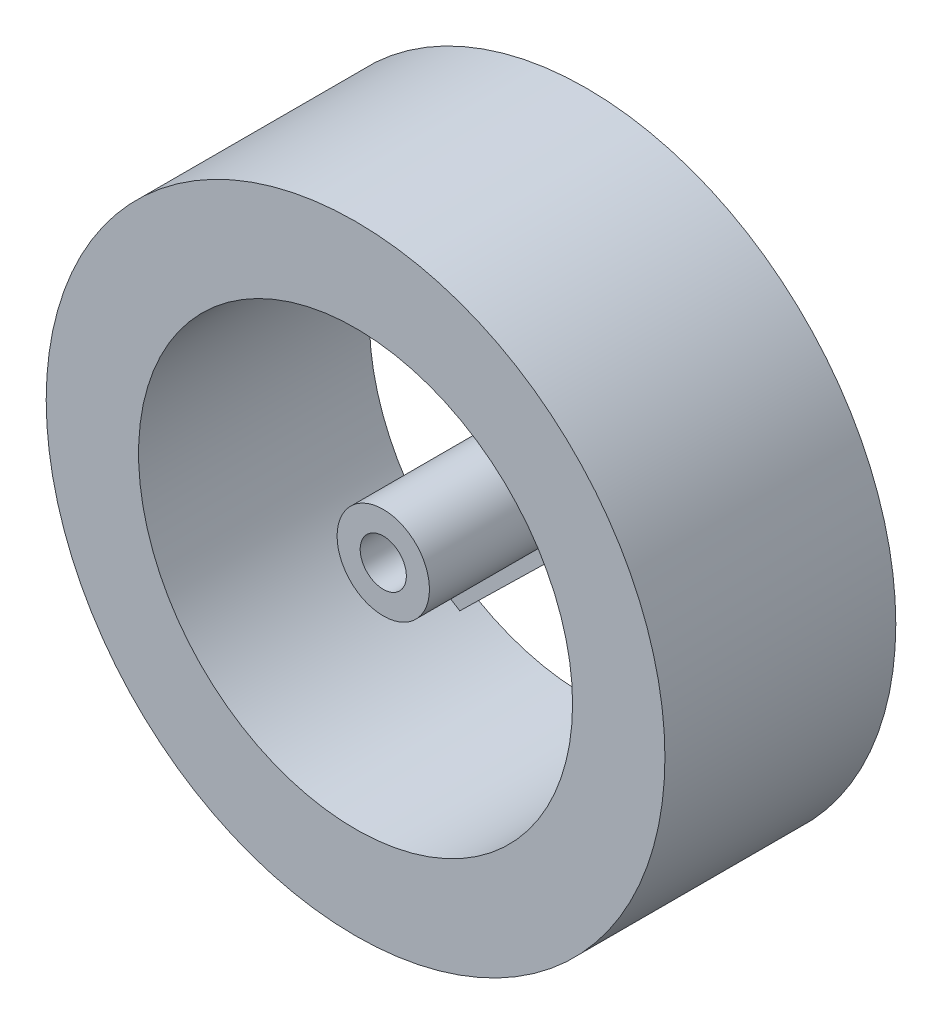
ISO-10303-21;
HEADER;
FILE_DESCRIPTION(('STEP AP214'),'2;1');
FILE_NAME('part.step','',(''),(''),'','','');
FILE_SCHEMA(('AUTOMOTIVE_DESIGN { 1 0 10303 214 1 1 1 1 }'));
ENDSEC;
DATA;
#1=APPLICATION_CONTEXT('core data for automotive mechanical design processes');
#2=APPLICATION_PROTOCOL_DEFINITION('international standard','automotive_design',2000,#1);
#3=PRODUCT_CONTEXT('',#1,'mechanical');
#4=PRODUCT('Part','Part','',(#3));
#5=PRODUCT_RELATED_PRODUCT_CATEGORY('part','',(#4));
#6=PRODUCT_DEFINITION_FORMATION('','',#4);
#7=PRODUCT_DEFINITION_CONTEXT('part definition',#1,'design');
#8=PRODUCT_DEFINITION('design','',#6,#7);
#9=PRODUCT_DEFINITION_SHAPE('','',#8);
#10=(LENGTH_UNIT() NAMED_UNIT(*) SI_UNIT(.MILLI.,.METRE.));
#11=(NAMED_UNIT(*) PLANE_ANGLE_UNIT() SI_UNIT($,.RADIAN.));
#12=(NAMED_UNIT(*) SI_UNIT($,.STERADIAN.) SOLID_ANGLE_UNIT());
#13=UNCERTAINTY_MEASURE_WITH_UNIT(LENGTH_MEASURE(1.E-05),#10,'distance_accuracy_value','');
#14=(GEOMETRIC_REPRESENTATION_CONTEXT(3) GLOBAL_UNCERTAINTY_ASSIGNED_CONTEXT((#13)) GLOBAL_UNIT_ASSIGNED_CONTEXT((#10,
#11,#12)) REPRESENTATION_CONTEXT('',''));
#15=CARTESIAN_POINT('',(0.,0.,0.));
#16=DIRECTION('',(0.,0.,1.));
#17=DIRECTION('',(1.,0.,0.));
#18=AXIS2_PLACEMENT_3D('',#15,#16,#17);
#19=CARTESIAN_POINT('',(0.,0.,25.));
#20=DIRECTION('',(0.,0.,-1.));
#21=DIRECTION('',(-1.,0.,0.));
#22=AXIS2_PLACEMENT_3D('',#19,#20,#21);
#23=CYLINDRICAL_SURFACE('',#22,23.5);
#24=CARTESIAN_POINT('',(0.,0.,25.));
#25=DIRECTION('',(0.,0.,1.));
#26=DIRECTION('',(1.,0.,0.));
#27=AXIS2_PLACEMENT_3D('',#24,#25,#26);
#28=CIRCLE('',#27,23.5);
#29=CARTESIAN_POINT('',(23.5,0.,25.));
#30=VERTEX_POINT('',#29);
#31=EDGE_CURVE('E316',#30,#30,#28,.T.);
#32=ORIENTED_EDGE('',*,*,#31,.T.);
#33=EDGE_LOOP('',(#32));
#34=FACE_BOUND('',#33,.T.);
#35=CARTESIAN_POINT('',(0.,0.,2.));
#36=DIRECTION('',(0.,0.,-1.));
#37=DIRECTION('',(-1.,0.,0.));
#38=AXIS2_PLACEMENT_3D('',#35,#36,#37);
#39=CIRCLE('',#38,23.5);
#40=CARTESIAN_POINT('',(-21.4504554995812,9.598331045577,2.));
#41=VERTEX_POINT('',#40);
#42=CARTESIAN_POINT('',(-22.9955404714559,4.84304846410122,2.));
#43=VERTEX_POINT('',#42);
#44=EDGE_CURVE('E237',#41,#43,#39,.F.);
#45=ORIENTED_EDGE('',*,*,#44,.F.);
#46=DIRECTION('',(0.,0.,-1.));
#47=VECTOR('',#46,1.);
#48=CARTESIAN_POINT('',(-21.4504554995812,9.598331045577,2.));
#49=LINE('',#48,#47);
#50=CARTESIAN_POINT('',(-21.4504554995812,9.598331045577,0.));
#51=VERTEX_POINT('',#50);
#52=EDGE_CURVE('E281',#41,#51,#49,.T.);
#53=ORIENTED_EDGE('',*,*,#52,.T.);
#54=CARTESIAN_POINT('',(0.,0.,0.));
#55=DIRECTION('',(0.,0.,1.));
#56=DIRECTION('',(1.,0.,0.));
#57=AXIS2_PLACEMENT_3D('',#54,#55,#56);
#58=CIRCLE('',#57,23.5);
#59=CARTESIAN_POINT('',(-2.5,23.3666428910959,0.));
#60=VERTEX_POINT('',#59);
#61=EDGE_CURVE('E339',#60,#51,#58,.T.);
#62=ORIENTED_EDGE('',*,*,#61,.F.);
#63=DIRECTION('',(0.,0.,-1.));
#64=VECTOR('',#63,1.);
#65=CARTESIAN_POINT('',(-2.5,23.3666428910959,2.));
#66=LINE('',#65,#64);
#67=CARTESIAN_POINT('',(-2.5,23.3666428910959,2.));
#68=VERTEX_POINT('',#67);
#69=EDGE_CURVE('E274',#68,#60,#66,.T.);
#70=ORIENTED_EDGE('',*,*,#69,.F.);
#71=CARTESIAN_POINT('',(0.,0.,2.));
#72=DIRECTION('',(0.,0.,-1.));
#73=DIRECTION('',(-1.,0.,0.));
#74=AXIS2_PLACEMENT_3D('',#71,#72,#73);
#75=CIRCLE('',#74,23.5);
#76=CARTESIAN_POINT('',(2.5,23.3666428910959,2.));
#77=VERTEX_POINT('',#76);
#78=EDGE_CURVE('E188',#77,#68,#75,.F.);
#79=ORIENTED_EDGE('',*,*,#78,.F.);
#80=DIRECTION('',(0.,0.,-1.));
#81=VECTOR('',#80,1.);
#82=CARTESIAN_POINT('',(2.5,23.3666428910959,2.));
#83=LINE('',#82,#81);
#84=CARTESIAN_POINT('',(2.5,23.3666428910959,0.));
#85=VERTEX_POINT('',#84);
#86=EDGE_CURVE('E194',#77,#85,#83,.T.);
#87=ORIENTED_EDGE('',*,*,#86,.T.);
#88=CARTESIAN_POINT('',(21.4504554995811,9.5983310455773,0.));
#89=VERTEX_POINT('',#88);
#90=EDGE_CURVE('E320',#89,#85,#58,.T.);
#91=ORIENTED_EDGE('',*,*,#90,.F.);
#92=DIRECTION('',(0.,0.,-1.));
#93=VECTOR('',#92,1.);
#94=CARTESIAN_POINT('',(21.4504554995811,9.5983310455773,2.));
#95=LINE('',#94,#93);
#96=CARTESIAN_POINT('',(21.4504554995811,9.5983310455773,2.));
#97=VERTEX_POINT('',#96);
#98=EDGE_CURVE('E312',#97,#89,#95,.T.);
#99=ORIENTED_EDGE('',*,*,#98,.F.);
#100=CARTESIAN_POINT('',(0.,0.,2.));
#101=DIRECTION('',(0.,0.,-1.));
#102=DIRECTION('',(-1.,0.,0.));
#103=AXIS2_PLACEMENT_3D('',#100,#101,#102);
#104=CIRCLE('',#103,23.5);
#105=CARTESIAN_POINT('',(22.9955404714558,4.84304846410155,2.));
#106=VERTEX_POINT('',#105);
#107=EDGE_CURVE('E206',#106,#97,#104,.F.);
#108=ORIENTED_EDGE('',*,*,#107,.F.);
#109=DIRECTION('',(0.,0.,-1.));
#110=VECTOR('',#109,1.);
#111=CARTESIAN_POINT('',(22.9955404714558,4.84304846410155,2.));
#112=LINE('',#111,#110);
#113=CARTESIAN_POINT('',(22.9955404714558,4.84304846410155,0.));
#114=VERTEX_POINT('',#113);
#115=EDGE_CURVE('E309',#106,#114,#112,.T.);
#116=ORIENTED_EDGE('',*,*,#115,.T.);
#117=CARTESIAN_POINT('',(15.7571105729084,-17.4345480696558,0.));
#118=VERTEX_POINT('',#117);
#119=EDGE_CURVE('E273',#118,#114,#58,.T.);
#120=ORIENTED_EDGE('',*,*,#119,.F.);
#121=DIRECTION('',(0.,0.,-1.));
#122=VECTOR('',#121,1.);
#123=CARTESIAN_POINT('',(15.7571105729084,-17.4345480696558,2.));
#124=LINE('',#123,#122);
#125=CARTESIAN_POINT('',(15.7571105729084,-17.4345480696558,2.));
#126=VERTEX_POINT('',#125);
#127=EDGE_CURVE('E303',#126,#118,#124,.T.);
#128=ORIENTED_EDGE('',*,*,#127,.F.);
#129=CARTESIAN_POINT('',(0.,0.,2.));
#130=DIRECTION('',(0.,0.,-1.));
#131=DIRECTION('',(-1.,0.,0.));
#132=AXIS2_PLACEMENT_3D('',#129,#130,#131);
#133=CIRCLE('',#132,23.5);
#134=CARTESIAN_POINT('',(11.7120256010337,-20.3734743311182,2.));
#135=VERTEX_POINT('',#134);
#136=EDGE_CURVE('E219',#135,#126,#133,.F.);
#137=ORIENTED_EDGE('',*,*,#136,.F.);
#138=DIRECTION('',(0.,0.,-1.));
#139=VECTOR('',#138,1.);
#140=CARTESIAN_POINT('',(11.7120256010337,-20.3734743311182,2.));
#141=LINE('',#140,#139);
#142=CARTESIAN_POINT('',(11.7120256010337,-20.3734743311182,0.));
#143=VERTEX_POINT('',#142);
#144=EDGE_CURVE('E300',#135,#143,#141,.T.);
#145=ORIENTED_EDGE('',*,*,#144,.T.);
#146=CARTESIAN_POINT('',(-11.7120256010334,-20.3734743311183,0.));
#147=VERTEX_POINT('',#146);
#148=EDGE_CURVE('E322',#147,#143,#58,.T.);
#149=ORIENTED_EDGE('',*,*,#148,.F.);
#150=DIRECTION('',(0.,0.,-1.));
#151=VECTOR('',#150,1.);
#152=CARTESIAN_POINT('',(-11.7120256010334,-20.3734743311183,2.));
#153=LINE('',#152,#151);
#154=CARTESIAN_POINT('',(-11.7120256010334,-20.3734743311183,2.));
#155=VERTEX_POINT('',#154);
#156=EDGE_CURVE('E294',#155,#147,#153,.T.);
#157=ORIENTED_EDGE('',*,*,#156,.F.);
#158=CARTESIAN_POINT('',(0.,0.,2.));
#159=DIRECTION('',(0.,0.,-1.));
#160=DIRECTION('',(-1.,0.,0.));
#161=AXIS2_PLACEMENT_3D('',#158,#159,#160);
#162=CIRCLE('',#161,23.5);
#163=CARTESIAN_POINT('',(-15.7571105729082,-17.434548069656,2.));
#164=VERTEX_POINT('',#163);
#165=EDGE_CURVE('E228',#164,#155,#162,.F.);
#166=ORIENTED_EDGE('',*,*,#165,.F.);
#167=DIRECTION('',(0.,0.,-1.));
#168=VECTOR('',#167,1.);
#169=CARTESIAN_POINT('',(-15.7571105729082,-17.434548069656,2.));
#170=LINE('',#169,#168);
#171=CARTESIAN_POINT('',(-15.7571105729082,-17.434548069656,0.));
#172=VERTEX_POINT('',#171);
#173=EDGE_CURVE('E291',#164,#172,#170,.T.);
#174=ORIENTED_EDGE('',*,*,#173,.T.);
#175=CARTESIAN_POINT('',(-22.9955404714559,4.84304846410122,0.));
#176=VERTEX_POINT('',#175);
#177=EDGE_CURVE('E337',#176,#172,#58,.T.);
#178=ORIENTED_EDGE('',*,*,#177,.F.);
#179=DIRECTION('',(0.,0.,-1.));
#180=VECTOR('',#179,1.);
#181=CARTESIAN_POINT('',(-22.9955404714559,4.84304846410122,2.));
#182=LINE('',#181,#180);
#183=EDGE_CURVE('E284',#43,#176,#182,.T.);
#184=ORIENTED_EDGE('',*,*,#183,.F.);
#185=EDGE_LOOP('',(#45,#53,#62,#70,#79,#87,#91,#99,#108,#116,#120,#128,#137,#145,#149,#157,#166,
#174,#178,#184));
#186=FACE_BOUND('',#185,.T.);
#187=ADVANCED_FACE('F37',(#34,#186),#23,.F.);
#188=CARTESIAN_POINT('',(0.,0.,25.));
#189=DIRECTION('',(0.,0.,1.));
#190=DIRECTION('',(1.,0.,0.));
#191=AXIS2_PLACEMENT_3D('',#188,#189,#190);
#192=PLANE('',#191);
#193=CARTESIAN_POINT('',(0.,0.,25.));
#194=DIRECTION('',(0.,0.,1.));
#195=DIRECTION('',(1.,0.,0.));
#196=AXIS2_PLACEMENT_3D('',#193,#194,#195);
#197=CIRCLE('',#196,33.5);
#198=CARTESIAN_POINT('',(33.5,0.,25.));
#199=VERTEX_POINT('',#198);
#200=EDGE_CURVE('E45',#199,#199,#197,.T.);
#201=ORIENTED_EDGE('',*,*,#200,.T.);
#202=EDGE_LOOP('',(#201));
#203=FACE_BOUND('',#202,.T.);
#204=ORIENTED_EDGE('',*,*,#31,.F.);
#205=EDGE_LOOP('',(#204));
#206=FACE_BOUND('',#205,.T.);
#207=ADVANCED_FACE('F330',(#203,#206),#192,.T.);
#208=CARTESIAN_POINT('',(0.,0.,0.));
#209=DIRECTION('',(0.,0.,1.));
#210=DIRECTION('',(1.,0.,0.));
#211=AXIS2_PLACEMENT_3D('',#208,#209,#210);
#212=PLANE('',#211);
#213=DIRECTION('',(-0.885817411892807,0.464033956502678,0.));
#214=VECTOR('',#213,1.);
#215=CARTESIAN_POINT('',(-2.96084057115355,-5.65209527236682,0.));
#216=LINE('',#215,#214);
#217=CARTESIAN_POINT('',(-9.78147600733805,-2.07911690817762,0.));
#218=VERTEX_POINT('',#217);
#219=EDGE_CURVE('E267',#218,#176,#216,.T.);
#220=ORIENTED_EDGE('',*,*,#219,.T.);
#221=ORIENTED_EDGE('',*,*,#177,.T.);
#222=DIRECTION('',(-0.443889023939305,-0.896081767712194,0.));
#223=VECTOR('',#222,1.);
#224=CARTESIAN_POINT('',(-5.71758858534729,2.83230270705772,0.));
#225=LINE('',#224,#223);
#226=CARTESIAN_POINT('',(-9.13545457642599,-4.06736643075806,0.));
#227=VERTEX_POINT('',#226);
#228=EDGE_CURVE('E264',#227,#172,#225,.T.);
#229=ORIENTED_EDGE('',*,*,#228,.F.);
#230=CARTESIAN_POINT('',(0.,0.,0.));
#231=DIRECTION('',(0.,0.,-1.));
#232=DIRECTION('',(-1.,0.,0.));
#233=AXIS2_PLACEMENT_3D('',#230,#231,#232);
#234=CIRCLE('',#233,10.);
#235=EDGE_CURVE('E266',#227,#218,#234,.T.);
#236=ORIENTED_EDGE('',*,*,#235,.T.);
#237=EDGE_LOOP('',(#220,#221,#229,#236));
#238=FACE_BOUND('',#237,.T.);
#239=DIRECTION('',(0.167589883925987,0.985856800354734,0.));
#240=VECTOR('',#239,1.);
#241=CARTESIAN_POINT('',(-6.29041209362676,1.06933322591902,0.));
#242=LINE('',#241,#240);
#243=CARTESIAN_POINT('',(-5.,8.66025403784439,0.));
#244=VERTEX_POINT('',#243);
#245=EDGE_CURVE('E197',#244,#60,#242,.T.);
#246=ORIENTED_EDGE('',*,*,#245,.T.);
#247=ORIENTED_EDGE('',*,*,#61,.T.);
#248=DIRECTION('',(-0.989393656329716,0.145259054156762,0.));
#249=VECTOR('',#248,1.);
#250=CARTESIAN_POINT('',(0.926847905951142,6.31297955128433,0.));
#251=LINE('',#250,#249);
#252=CARTESIAN_POINT('',(-6.69130606358861,7.43144825477392,0.));
#253=VERTEX_POINT('',#252);
#254=EDGE_CURVE('E269',#253,#51,#251,.T.);
#255=ORIENTED_EDGE('',*,*,#254,.F.);
#256=EDGE_CURVE('E254',#253,#244,#234,.T.);
#257=ORIENTED_EDGE('',*,*,#256,.T.);
#258=EDGE_LOOP('',(#246,#247,#255,#257));
#259=FACE_BOUND('',#258,.T.);
#260=DIRECTION('',(0.989393656329713,0.145259054156776,0.));
#261=VECTOR('',#260,1.);
#262=CARTESIAN_POINT('',(-0.926847905951231,6.31297955128432,0.));
#263=LINE('',#262,#261);
#264=CARTESIAN_POINT('',(6.6913060635885,7.43144825477402,0.));
#265=VERTEX_POINT('',#264);
#266=EDGE_CURVE('E253',#265,#89,#263,.T.);
#267=ORIENTED_EDGE('',*,*,#266,.T.);
#268=ORIENTED_EDGE('',*,*,#90,.T.);
#269=DIRECTION('',(-0.167589883925987,0.985856800354734,0.));
#270=VECTOR('',#269,1.);
#271=CARTESIAN_POINT('',(6.29041209362676,1.06933322591902,0.));
#272=LINE('',#271,#270);
#273=CARTESIAN_POINT('',(5.,8.66025403784439,0.));
#274=VERTEX_POINT('',#273);
#275=EDGE_CURVE('E249',#274,#85,#272,.T.);
#276=ORIENTED_EDGE('',*,*,#275,.F.);
#277=EDGE_CURVE('E184',#274,#265,#234,.T.);
#278=ORIENTED_EDGE('',*,*,#277,.T.);
#279=EDGE_LOOP('',(#267,#268,#276,#278));
#280=FACE_BOUND('',#279,.T.);
#281=DIRECTION('',(0.443889023939318,-0.896081767712188,0.));
#282=VECTOR('',#281,1.);
#283=CARTESIAN_POINT('',(5.71758858534725,2.83230270705781,0.));
#284=LINE('',#283,#282);
#285=CARTESIAN_POINT('',(9.13545457642605,-4.06736643075792,0.));
#286=VERTEX_POINT('',#285);
#287=EDGE_CURVE('E52',#286,#118,#284,.T.);
#288=ORIENTED_EDGE('',*,*,#287,.T.);
#289=ORIENTED_EDGE('',*,*,#119,.T.);
#290=DIRECTION('',(0.8858174118928,0.46403395650269,0.));
#291=VECTOR('',#290,1.);
#292=CARTESIAN_POINT('',(2.96084057115362,-5.65209527236677,0.));
#293=LINE('',#292,#291);
#294=CARTESIAN_POINT('',(9.78147600733808,-2.07911690817748,0.));
#295=VERTEX_POINT('',#294);
#296=EDGE_CURVE('E257',#295,#114,#293,.T.);
#297=ORIENTED_EDGE('',*,*,#296,.F.);
#298=EDGE_CURVE('E255',#295,#286,#234,.T.);
#299=ORIENTED_EDGE('',*,*,#298,.T.);
#300=EDGE_LOOP('',(#288,#289,#297,#299));
#301=FACE_BOUND('',#300,.T.);
#302=CARTESIAN_POINT('',(0.,0.,0.));
#303=DIRECTION('',(0.,0.,1.));
#304=DIRECTION('',(1.,0.,0.));
#305=AXIS2_PLACEMENT_3D('',#302,#303,#304);
#306=CIRCLE('',#305,33.5);
#307=CARTESIAN_POINT('',(33.5,0.,0.));
#308=VERTEX_POINT('',#307);
#309=EDGE_CURVE('E319',#308,#308,#306,.T.);
#310=ORIENTED_EDGE('',*,*,#309,.F.);
#311=EDGE_LOOP('',(#310));
#312=FACE_BOUND('',#311,.T.);
#313=ORIENTED_EDGE('',*,*,#148,.T.);
#314=DIRECTION('',(0.715055152302212,-0.699068043301981,0.));
#315=VECTOR('',#314,1.);
#316=CARTESIAN_POINT('',(-4.46051198538416,-4.56252021189434,0.));
#317=LINE('',#316,#315);
#318=CARTESIAN_POINT('',(1.04528463267663,-9.94521895368272,0.));
#319=VERTEX_POINT('',#318);
#320=EDGE_CURVE('E260',#319,#143,#317,.T.);
#321=ORIENTED_EDGE('',*,*,#320,.F.);
#322=CARTESIAN_POINT('',(-1.04528463267648,-9.94521895368274,0.));
#323=VERTEX_POINT('',#322);
#324=EDGE_CURVE('E262',#319,#323,#234,.T.);
#325=ORIENTED_EDGE('',*,*,#324,.T.);
#326=DIRECTION('',(-0.715055152302202,-0.699068043301991,0.));
#327=VECTOR('',#326,1.);
#328=CARTESIAN_POINT('',(4.46051198538423,-4.56252021189428,0.));
#329=LINE('',#328,#327);
#330=EDGE_CURVE('E60',#323,#147,#329,.T.);
#331=ORIENTED_EDGE('',*,*,#330,.T.);
#332=EDGE_LOOP('',(#313,#321,#325,#331));
#333=FACE_BOUND('',#332,.T.);
#334=ADVANCED_FACE('F328',(#238,#259,#280,#301,#312,#333),#212,.F.);
#335=CARTESIAN_POINT('',(0.,0.,25.));
#336=DIRECTION('',(0.,0.,-1.));
#337=DIRECTION('',(-1.,0.,0.));
#338=AXIS2_PLACEMENT_3D('',#335,#336,#337);
#339=CYLINDRICAL_SURFACE('',#338,33.5);
#340=ORIENTED_EDGE('',*,*,#200,.F.);
#341=EDGE_LOOP('',(#340));
#342=FACE_BOUND('',#341,.T.);
#343=ORIENTED_EDGE('',*,*,#309,.T.);
#344=EDGE_LOOP('',(#343));
#345=FACE_BOUND('',#344,.T.);
#346=ADVANCED_FACE('F39',(#342,#345),#339,.T.);
#347=CARTESIAN_POINT('',(6.29041209362676,1.06933322591902,2.));
#348=DIRECTION('',(-0.985856800354734,-0.167589883925987,0.));
#349=DIRECTION('',(0.167589883925987,-0.985856800354734,0.));
#350=AXIS2_PLACEMENT_3D('',#347,#348,#349);
#351=PLANE('',#350);
#352=ORIENTED_EDGE('',*,*,#275,.T.);
#353=ORIENTED_EDGE('',*,*,#86,.F.);
#354=DIRECTION('',(-0.167589883925987,0.985856800354734,0.));
#355=VECTOR('',#354,1.);
#356=CARTESIAN_POINT('',(6.29041209362676,1.06933322591902,2.));
#357=LINE('',#356,#355);
#358=CARTESIAN_POINT('',(5.,8.66025403784439,2.));
#359=VERTEX_POINT('',#358);
#360=EDGE_CURVE('E191',#359,#77,#357,.T.);
#361=ORIENTED_EDGE('',*,*,#360,.F.);
#362=DIRECTION('',(0.,0.,-1.));
#363=VECTOR('',#362,1.);
#364=CARTESIAN_POINT('',(5.,8.66025403784439,2.));
#365=LINE('',#364,#363);
#366=EDGE_CURVE('E178',#359,#274,#365,.T.);
#367=ORIENTED_EDGE('',*,*,#366,.T.);
#368=EDGE_LOOP('',(#352,#353,#361,#367));
#369=FACE_BOUND('',#368,.T.);
#370=ADVANCED_FACE('F192',(#369),#351,.F.);
#371=CARTESIAN_POINT('',(-6.29041209362676,1.06933322591902,2.));
#372=DIRECTION('',(-0.985856800354734,0.167589883925987,0.));
#373=DIRECTION('',(-0.167589883925987,-0.985856800354734,0.));
#374=AXIS2_PLACEMENT_3D('',#371,#372,#373);
#375=PLANE('',#374);
#376=ORIENTED_EDGE('',*,*,#245,.F.);
#377=DIRECTION('',(0.,0.,-1.));
#378=VECTOR('',#377,1.);
#379=CARTESIAN_POINT('',(-5.,8.66025403784439,2.));
#380=LINE('',#379,#378);
#381=CARTESIAN_POINT('',(-5.,8.66025403784439,2.));
#382=VERTEX_POINT('',#381);
#383=EDGE_CURVE('E277',#382,#244,#380,.T.);
#384=ORIENTED_EDGE('',*,*,#383,.F.);
#385=DIRECTION('',(0.167589883925987,0.985856800354734,0.));
#386=VECTOR('',#385,1.);
#387=CARTESIAN_POINT('',(-6.29041209362676,1.06933322591902,2.));
#388=LINE('',#387,#386);
#389=EDGE_CURVE('E209',#382,#68,#388,.T.);
#390=ORIENTED_EDGE('',*,*,#389,.T.);
#391=ORIENTED_EDGE('',*,*,#69,.T.);
#392=EDGE_LOOP('',(#376,#384,#390,#391));
#393=FACE_BOUND('',#392,.T.);
#394=ADVANCED_FACE('F358',(#393),#375,.T.);
#395=CARTESIAN_POINT('',(0.,0.,2.));
#396=DIRECTION('',(0.,0.,-1.));
#397=DIRECTION('',(-1.,0.,0.));
#398=AXIS2_PLACEMENT_3D('',#395,#396,#397);
#399=CYLINDRICAL_SURFACE('',#398,10.);
#400=ORIENTED_EDGE('',*,*,#256,.F.);
#401=DIRECTION('',(0.,0.,-1.));
#402=VECTOR('',#401,1.);
#403=CARTESIAN_POINT('',(-6.69130606358861,7.43144825477392,2.));
#404=LINE('',#403,#402);
#405=CARTESIAN_POINT('',(-6.69130606358861,7.43144825477392,2.));
#406=VERTEX_POINT('',#405);
#407=EDGE_CURVE('E279',#406,#253,#404,.T.);
#408=ORIENTED_EDGE('',*,*,#407,.F.);
#409=CARTESIAN_POINT('',(0.,0.,2.));
#410=DIRECTION('',(0.,0.,-1.));
#411=DIRECTION('',(-1.,0.,0.));
#412=AXIS2_PLACEMENT_3D('',#409,#410,#411);
#413=CIRCLE('',#412,10.);
#414=EDGE_CURVE('E204',#406,#382,#413,.T.);
#415=ORIENTED_EDGE('',*,*,#414,.T.);
#416=ORIENTED_EDGE('',*,*,#383,.T.);
#417=EDGE_LOOP('',(#400,#408,#415,#416));
#418=FACE_BOUND('',#417,.T.);
#419=ADVANCED_FACE('F362',(#418),#399,.T.);
#420=CARTESIAN_POINT('',(0.926847905951142,6.31297955128433,2.));
#421=DIRECTION('',(-0.145259054156762,-0.989393656329716,0.));
#422=DIRECTION('',(0.989393656329715,-0.145259054156762,0.));
#423=AXIS2_PLACEMENT_3D('',#420,#421,#422);
#424=PLANE('',#423);
#425=ORIENTED_EDGE('',*,*,#254,.T.);
#426=ORIENTED_EDGE('',*,*,#52,.F.);
#427=DIRECTION('',(-0.989393656329716,0.145259054156762,0.));
#428=VECTOR('',#427,1.);
#429=CARTESIAN_POINT('',(0.926847905951142,6.31297955128433,2.));
#430=LINE('',#429,#428);
#431=EDGE_CURVE('E210',#406,#41,#430,.T.);
#432=ORIENTED_EDGE('',*,*,#431,.F.);
#433=ORIENTED_EDGE('',*,*,#407,.T.);
#434=EDGE_LOOP('',(#425,#426,#432,#433));
#435=FACE_BOUND('',#434,.T.);
#436=ADVANCED_FACE('F367',(#435),#424,.F.);
#437=CARTESIAN_POINT('',(-2.96084057115355,-5.65209527236682,2.));
#438=DIRECTION('',(-0.464033956502678,-0.885817411892807,0.));
#439=DIRECTION('',(0.885817411892807,-0.464033956502678,0.));
#440=AXIS2_PLACEMENT_3D('',#437,#438,#439);
#441=PLANE('',#440);
#442=ORIENTED_EDGE('',*,*,#219,.F.);
#443=DIRECTION('',(0.,0.,-1.));
#444=VECTOR('',#443,1.);
#445=CARTESIAN_POINT('',(-9.78147600733805,-2.07911690817762,2.));
#446=LINE('',#445,#444);
#447=CARTESIAN_POINT('',(-9.78147600733805,-2.07911690817762,2.));
#448=VERTEX_POINT('',#447);
#449=EDGE_CURVE('E287',#448,#218,#446,.T.);
#450=ORIENTED_EDGE('',*,*,#449,.F.);
#451=DIRECTION('',(-0.885817411892807,0.464033956502678,0.));
#452=VECTOR('',#451,1.);
#453=CARTESIAN_POINT('',(-2.96084057115355,-5.65209527236682,2.));
#454=LINE('',#453,#452);
#455=EDGE_CURVE('E232',#448,#43,#454,.T.);
#456=ORIENTED_EDGE('',*,*,#455,.T.);
#457=ORIENTED_EDGE('',*,*,#183,.T.);
#458=EDGE_LOOP('',(#442,#450,#456,#457));
#459=FACE_BOUND('',#458,.T.);
#460=ADVANCED_FACE('F371',(#459),#441,.T.);
#461=ORIENTED_EDGE('',*,*,#235,.F.);
#462=DIRECTION('',(0.,0.,-1.));
#463=VECTOR('',#462,1.);
#464=CARTESIAN_POINT('',(-9.13545457642599,-4.06736643075806,2.));
#465=LINE('',#464,#463);
#466=CARTESIAN_POINT('',(-9.13545457642599,-4.06736643075806,2.));
#467=VERTEX_POINT('',#466);
#468=EDGE_CURVE('E289',#467,#227,#465,.T.);
#469=ORIENTED_EDGE('',*,*,#468,.F.);
#470=EDGE_CURVE('E211',#467,#448,#413,.T.);
#471=ORIENTED_EDGE('',*,*,#470,.T.);
#472=ORIENTED_EDGE('',*,*,#449,.T.);
#473=EDGE_LOOP('',(#461,#469,#471,#472));
#474=FACE_BOUND('',#473,.T.);
#475=ADVANCED_FACE('F374',(#474),#399,.T.);
#476=CARTESIAN_POINT('',(-5.71758858534729,2.83230270705772,2.));
#477=DIRECTION('',(0.896081767712195,-0.443889023939305,0.));
#478=DIRECTION('',(0.443889023939305,0.896081767712195,0.));
#479=AXIS2_PLACEMENT_3D('',#476,#477,#478);
#480=PLANE('',#479);
#481=ORIENTED_EDGE('',*,*,#228,.T.);
#482=ORIENTED_EDGE('',*,*,#173,.F.);
#483=DIRECTION('',(-0.443889023939305,-0.896081767712194,0.));
#484=VECTOR('',#483,1.);
#485=CARTESIAN_POINT('',(-5.71758858534729,2.83230270705772,2.));
#486=LINE('',#485,#484);
#487=EDGE_CURVE('E233',#467,#164,#486,.T.);
#488=ORIENTED_EDGE('',*,*,#487,.F.);
#489=ORIENTED_EDGE('',*,*,#468,.T.);
#490=EDGE_LOOP('',(#481,#482,#488,#489));
#491=FACE_BOUND('',#490,.T.);
#492=ADVANCED_FACE('F499',(#491),#480,.F.);
#493=CARTESIAN_POINT('',(4.46051198538423,-4.56252021189428,2.));
#494=DIRECTION('',(0.699068043301991,-0.715055152302202,0.));
#495=DIRECTION('',(0.715055152302202,0.699068043301991,0.));
#496=AXIS2_PLACEMENT_3D('',#493,#494,#495);
#497=PLANE('',#496);
#498=ORIENTED_EDGE('',*,*,#330,.F.);
#499=DIRECTION('',(0.,0.,-1.));
#500=VECTOR('',#499,1.);
#501=CARTESIAN_POINT('',(-1.04528463267648,-9.94521895368274,2.));
#502=LINE('',#501,#500);
#503=CARTESIAN_POINT('',(-1.04528463267648,-9.94521895368274,2.));
#504=VERTEX_POINT('',#503);
#505=EDGE_CURVE('E296',#504,#323,#502,.T.);
#506=ORIENTED_EDGE('',*,*,#505,.F.);
#507=DIRECTION('',(-0.715055152302202,-0.699068043301991,0.));
#508=VECTOR('',#507,1.);
#509=CARTESIAN_POINT('',(4.46051198538423,-4.56252021189428,2.));
#510=LINE('',#509,#508);
#511=EDGE_CURVE('E223',#504,#155,#510,.T.);
#512=ORIENTED_EDGE('',*,*,#511,.T.);
#513=ORIENTED_EDGE('',*,*,#156,.T.);
#514=EDGE_LOOP('',(#498,#506,#512,#513));
#515=FACE_BOUND('',#514,.T.);
#516=ADVANCED_FACE('F507',(#515),#497,.T.);
#517=ORIENTED_EDGE('',*,*,#324,.F.);
#518=DIRECTION('',(0.,0.,-1.));
#519=VECTOR('',#518,1.);
#520=CARTESIAN_POINT('',(1.04528463267663,-9.94521895368272,2.));
#521=LINE('',#520,#519);
#522=CARTESIAN_POINT('',(1.04528463267663,-9.94521895368272,2.));
#523=VERTEX_POINT('',#522);
#524=EDGE_CURVE('E298',#523,#319,#521,.T.);
#525=ORIENTED_EDGE('',*,*,#524,.F.);
#526=EDGE_CURVE('E215',#523,#504,#413,.T.);
#527=ORIENTED_EDGE('',*,*,#526,.T.);
#528=ORIENTED_EDGE('',*,*,#505,.T.);
#529=EDGE_LOOP('',(#517,#525,#527,#528));
#530=FACE_BOUND('',#529,.T.);
#531=ADVANCED_FACE('F500',(#530),#399,.T.);
#532=CARTESIAN_POINT('',(-4.46051198538416,-4.56252021189434,2.));
#533=DIRECTION('',(0.699068043301981,0.715055152302212,0.));
#534=DIRECTION('',(-0.715055152302212,0.699068043301981,0.));
#535=AXIS2_PLACEMENT_3D('',#532,#533,#534);
#536=PLANE('',#535);
#537=ORIENTED_EDGE('',*,*,#320,.T.);
#538=ORIENTED_EDGE('',*,*,#144,.F.);
#539=DIRECTION('',(0.715055152302212,-0.699068043301981,0.));
#540=VECTOR('',#539,1.);
#541=CARTESIAN_POINT('',(-4.46051198538416,-4.56252021189434,2.));
#542=LINE('',#541,#540);
#543=EDGE_CURVE('E224',#523,#135,#542,.T.);
#544=ORIENTED_EDGE('',*,*,#543,.F.);
#545=ORIENTED_EDGE('',*,*,#524,.T.);
#546=EDGE_LOOP('',(#537,#538,#544,#545));
#547=FACE_BOUND('',#546,.T.);
#548=ADVANCED_FACE('F524',(#547),#536,.F.);
#549=CARTESIAN_POINT('',(5.71758858534725,2.83230270705781,2.));
#550=DIRECTION('',(0.896081767712188,0.443889023939318,0.));
#551=DIRECTION('',(-0.443889023939318,0.896081767712188,0.));
#552=AXIS2_PLACEMENT_3D('',#549,#550,#551);
#553=PLANE('',#552);
#554=ORIENTED_EDGE('',*,*,#287,.F.);
#555=DIRECTION('',(0.,0.,-1.));
#556=VECTOR('',#555,1.);
#557=CARTESIAN_POINT('',(9.13545457642605,-4.06736643075792,2.));
#558=LINE('',#557,#556);
#559=CARTESIAN_POINT('',(9.13545457642605,-4.06736643075792,2.));
#560=VERTEX_POINT('',#559);
#561=EDGE_CURVE('E305',#560,#286,#558,.T.);
#562=ORIENTED_EDGE('',*,*,#561,.F.);
#563=DIRECTION('',(0.443889023939318,-0.896081767712188,0.));
#564=VECTOR('',#563,1.);
#565=CARTESIAN_POINT('',(5.71758858534725,2.83230270705781,2.));
#566=LINE('',#565,#564);
#567=EDGE_CURVE('E213',#560,#126,#566,.T.);
#568=ORIENTED_EDGE('',*,*,#567,.T.);
#569=ORIENTED_EDGE('',*,*,#127,.T.);
#570=EDGE_LOOP('',(#554,#562,#568,#569));
#571=FACE_BOUND('',#570,.T.);
#572=ADVANCED_FACE('F381',(#571),#553,.T.);
#573=ORIENTED_EDGE('',*,*,#298,.F.);
#574=DIRECTION('',(0.,0.,-1.));
#575=VECTOR('',#574,1.);
#576=CARTESIAN_POINT('',(9.78147600733808,-2.07911690817748,2.));
#577=LINE('',#576,#575);
#578=CARTESIAN_POINT('',(9.78147600733808,-2.07911690817748,2.));
#579=VERTEX_POINT('',#578);
#580=EDGE_CURVE('E307',#579,#295,#577,.T.);
#581=ORIENTED_EDGE('',*,*,#580,.F.);
#582=EDGE_CURVE('E205',#579,#560,#413,.T.);
#583=ORIENTED_EDGE('',*,*,#582,.T.);
#584=ORIENTED_EDGE('',*,*,#561,.T.);
#585=EDGE_LOOP('',(#573,#581,#583,#584));
#586=FACE_BOUND('',#585,.T.);
#587=ADVANCED_FACE('F377',(#586),#399,.T.);
#588=CARTESIAN_POINT('',(2.96084057115362,-5.65209527236677,2.));
#589=DIRECTION('',(-0.46403395650269,0.8858174118928,0.));
#590=DIRECTION('',(-0.8858174118928,-0.46403395650269,0.));
#591=AXIS2_PLACEMENT_3D('',#588,#589,#590);
#592=PLANE('',#591);
#593=ORIENTED_EDGE('',*,*,#296,.T.);
#594=ORIENTED_EDGE('',*,*,#115,.F.);
#595=DIRECTION('',(0.8858174118928,0.46403395650269,0.));
#596=VECTOR('',#595,1.);
#597=CARTESIAN_POINT('',(2.96084057115362,-5.65209527236677,2.));
#598=LINE('',#597,#596);
#599=EDGE_CURVE('E214',#579,#106,#598,.T.);
#600=ORIENTED_EDGE('',*,*,#599,.F.);
#601=ORIENTED_EDGE('',*,*,#580,.T.);
#602=EDGE_LOOP('',(#593,#594,#600,#601));
#603=FACE_BOUND('',#602,.T.);
#604=ADVANCED_FACE('F387',(#603),#592,.F.);
#605=CARTESIAN_POINT('',(-0.926847905951231,6.31297955128432,2.));
#606=DIRECTION('',(-0.145259054156776,0.989393656329713,0.));
#607=DIRECTION('',(-0.989393656329713,-0.145259054156776,0.));
#608=AXIS2_PLACEMENT_3D('',#605,#606,#607);
#609=PLANE('',#608);
#610=ORIENTED_EDGE('',*,*,#266,.F.);
#611=DIRECTION('',(0.,0.,-1.));
#612=VECTOR('',#611,1.);
#613=CARTESIAN_POINT('',(6.6913060635885,7.43144825477402,2.));
#614=LINE('',#613,#612);
#615=CARTESIAN_POINT('',(6.6913060635885,7.43144825477402,2.));
#616=VERTEX_POINT('',#615);
#617=EDGE_CURVE('E187',#616,#265,#614,.T.);
#618=ORIENTED_EDGE('',*,*,#617,.F.);
#619=DIRECTION('',(0.989393656329713,0.145259054156776,0.));
#620=VECTOR('',#619,1.);
#621=CARTESIAN_POINT('',(-0.926847905951231,6.31297955128432,2.));
#622=LINE('',#621,#620);
#623=EDGE_CURVE('E202',#616,#97,#622,.T.);
#624=ORIENTED_EDGE('',*,*,#623,.T.);
#625=ORIENTED_EDGE('',*,*,#98,.T.);
#626=EDGE_LOOP('',(#610,#618,#624,#625));
#627=FACE_BOUND('',#626,.T.);
#628=ADVANCED_FACE('F393',(#627),#609,.T.);
#629=ORIENTED_EDGE('',*,*,#277,.F.);
#630=ORIENTED_EDGE('',*,*,#366,.F.);
#631=EDGE_CURVE('E182',#359,#616,#413,.T.);
#632=ORIENTED_EDGE('',*,*,#631,.T.);
#633=ORIENTED_EDGE('',*,*,#617,.T.);
#634=EDGE_LOOP('',(#629,#630,#632,#633));
#635=FACE_BOUND('',#634,.T.);
#636=ADVANCED_FACE('F180',(#635),#399,.T.);
#637=CARTESIAN_POINT('',(0.,0.,2.));
#638=DIRECTION('',(0.,0.,-1.));
#639=DIRECTION('',(-1.,0.,0.));
#640=AXIS2_PLACEMENT_3D('',#637,#638,#639);
#641=PLANE('',#640);
#642=CARTESIAN_POINT('',(0.,0.,2.));
#643=DIRECTION('',(0.,0.,-1.));
#644=DIRECTION('',(-1.,0.,0.));
#645=AXIS2_PLACEMENT_3D('',#642,#643,#644);
#646=CIRCLE('',#645,5.);
#647=CARTESIAN_POINT('',(-5.,0.,2.));
#648=VERTEX_POINT('',#647);
#649=EDGE_CURVE('E11',#648,#648,#646,.F.);
#650=ORIENTED_EDGE('',*,*,#649,.F.);
#651=EDGE_LOOP('',(#650));
#652=FACE_BOUND('',#651,.T.);
#653=ORIENTED_EDGE('',*,*,#360,.T.);
#654=ORIENTED_EDGE('',*,*,#78,.T.);
#655=ORIENTED_EDGE('',*,*,#389,.F.);
#656=ORIENTED_EDGE('',*,*,#414,.F.);
#657=ORIENTED_EDGE('',*,*,#431,.T.);
#658=ORIENTED_EDGE('',*,*,#44,.T.);
#659=ORIENTED_EDGE('',*,*,#455,.F.);
#660=ORIENTED_EDGE('',*,*,#470,.F.);
#661=ORIENTED_EDGE('',*,*,#487,.T.);
#662=ORIENTED_EDGE('',*,*,#165,.T.);
#663=ORIENTED_EDGE('',*,*,#511,.F.);
#664=ORIENTED_EDGE('',*,*,#526,.F.);
#665=ORIENTED_EDGE('',*,*,#543,.T.);
#666=ORIENTED_EDGE('',*,*,#136,.T.);
#667=ORIENTED_EDGE('',*,*,#567,.F.);
#668=ORIENTED_EDGE('',*,*,#582,.F.);
#669=ORIENTED_EDGE('',*,*,#599,.T.);
#670=ORIENTED_EDGE('',*,*,#107,.T.);
#671=ORIENTED_EDGE('',*,*,#623,.F.);
#672=ORIENTED_EDGE('',*,*,#631,.F.);
#673=EDGE_LOOP('',(#653,#654,#655,#656,#657,#658,#659,#660,#661,#662,#663,#664,#665,#666,#667,
#668,#669,#670,#671,#672));
#674=FACE_BOUND('',#673,.T.);
#675=ADVANCED_FACE('F200',(#652,#674),#641,.F.);
#676=CARTESIAN_POINT('',(0.,0.,22.));
#677=DIRECTION('',(0.,0.,1.));
#678=DIRECTION('',(1.,0.,0.));
#679=AXIS2_PLACEMENT_3D('',#676,#677,#678);
#680=PLANE('',#679);
#681=CARTESIAN_POINT('',(0.,0.,22.));
#682=DIRECTION('',(0.,0.,1.));
#683=DIRECTION('',(1.,0.,0.));
#684=AXIS2_PLACEMENT_3D('',#681,#682,#683);
#685=CIRCLE('',#684,5.);
#686=CARTESIAN_POINT('',(5.,0.,22.));
#687=VERTEX_POINT('',#686);
#688=EDGE_CURVE('E251',#687,#687,#685,.T.);
#689=ORIENTED_EDGE('',*,*,#688,.T.);
#690=EDGE_LOOP('',(#689));
#691=FACE_BOUND('',#690,.T.);
#692=CARTESIAN_POINT('',(0.,0.,22.));
#693=DIRECTION('',(0.,0.,1.));
#694=DIRECTION('',(1.,0.,0.));
#695=AXIS2_PLACEMENT_3D('',#692,#693,#694);
#696=CIRCLE('',#695,2.5);
#697=CARTESIAN_POINT('',(2.5,0.,22.));
#698=VERTEX_POINT('',#697);
#699=EDGE_CURVE('E648',#698,#698,#696,.T.);
#700=ORIENTED_EDGE('',*,*,#699,.F.);
#701=EDGE_LOOP('',(#700));
#702=FACE_BOUND('',#701,.T.);
#703=ADVANCED_FACE('F566',(#691,#702),#680,.T.);
#704=CARTESIAN_POINT('',(0.,0.,22.));
#705=DIRECTION('',(0.,0.,-1.));
#706=DIRECTION('',(-1.,0.,0.));
#707=AXIS2_PLACEMENT_3D('',#704,#705,#706);
#708=CYLINDRICAL_SURFACE('',#707,5.);
#709=ORIENTED_EDGE('',*,*,#688,.F.);
#710=EDGE_LOOP('',(#709));
#711=FACE_BOUND('',#710,.T.);
#712=ORIENTED_EDGE('',*,*,#649,.T.);
#713=EDGE_LOOP('',(#712));
#714=FACE_BOUND('',#713,.T.);
#715=ADVANCED_FACE('F621',(#711,#714),#708,.T.);
#716=CARTESIAN_POINT('',(0.,0.,22.));
#717=DIRECTION('',(0.,0.,-1.));
#718=DIRECTION('',(-1.,0.,0.));
#719=AXIS2_PLACEMENT_3D('',#716,#717,#718);
#720=CYLINDRICAL_SURFACE('',#719,2.5);
#721=ORIENTED_EDGE('',*,*,#699,.T.);
#722=EDGE_LOOP('',(#721));
#723=FACE_BOUND('',#722,.T.);
#724=CARTESIAN_POINT('',(0.,0.,2.));
#725=DIRECTION('',(0.,0.,1.));
#726=DIRECTION('',(1.,0.,0.));
#727=AXIS2_PLACEMENT_3D('',#724,#725,#726);
#728=CIRCLE('',#727,2.5);
#729=CARTESIAN_POINT('',(2.5,0.,2.));
#730=VERTEX_POINT('',#729);
#731=EDGE_CURVE('E651',#730,#730,#728,.T.);
#732=ORIENTED_EDGE('',*,*,#731,.F.);
#733=EDGE_LOOP('',(#732));
#734=FACE_BOUND('',#733,.T.);
#735=ADVANCED_FACE('F594',(#723,#734),#720,.F.);
#736=ORIENTED_EDGE('',*,*,#731,.T.);
#737=EDGE_LOOP('',(#736));
#738=FACE_BOUND('',#737,.T.);
#739=ADVANCED_FACE('F569',(#738),#641,.F.);
#740=CLOSED_SHELL('',(#187,#207,#334,#346,#370,#394,#419,#436,#460,#475,#492,#516,#531,#548,
#572,#587,#604,#628,#636,#675,#703,#715,#735,#739));
#741=MANIFOLD_SOLID_BREP('B2',#740);
#742=ADVANCED_BREP_SHAPE_REPRESENTATION('',(#18,#741),#14);
#743=SHAPE_DEFINITION_REPRESENTATION(#9,#742);
ENDSEC;
END-ISO-10303-21;
